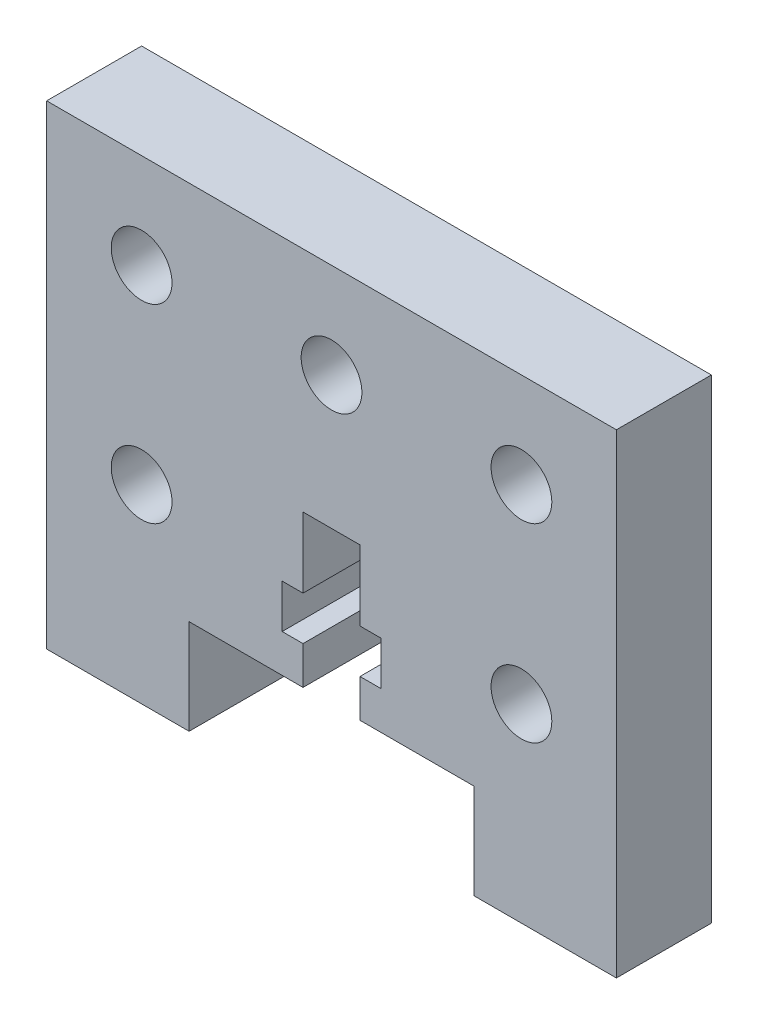
ISO-10303-21;
HEADER;
FILE_DESCRIPTION(('STEP AP214'),'2;1');
FILE_NAME('part.step','',(''),(''),'','','');
FILE_SCHEMA(('AUTOMOTIVE_DESIGN { 1 0 10303 214 1 1 1 1 }'));
ENDSEC;
DATA;
#1=APPLICATION_CONTEXT('core data for automotive mechanical design processes');
#2=APPLICATION_PROTOCOL_DEFINITION('international standard','automotive_design',2000,#1);
#3=PRODUCT_CONTEXT('',#1,'mechanical');
#4=PRODUCT('Part','Part','',(#3));
#5=PRODUCT_RELATED_PRODUCT_CATEGORY('part','',(#4));
#6=PRODUCT_DEFINITION_FORMATION('','',#4);
#7=PRODUCT_DEFINITION_CONTEXT('part definition',#1,'design');
#8=PRODUCT_DEFINITION('design','',#6,#7);
#9=PRODUCT_DEFINITION_SHAPE('','',#8);
#10=(LENGTH_UNIT() NAMED_UNIT(*) SI_UNIT(.MILLI.,.METRE.));
#11=(NAMED_UNIT(*) PLANE_ANGLE_UNIT() SI_UNIT($,.RADIAN.));
#12=(NAMED_UNIT(*) SI_UNIT($,.STERADIAN.) SOLID_ANGLE_UNIT());
#13=UNCERTAINTY_MEASURE_WITH_UNIT(LENGTH_MEASURE(1.E-05),#10,'distance_accuracy_value','');
#14=(GEOMETRIC_REPRESENTATION_CONTEXT(3) GLOBAL_UNCERTAINTY_ASSIGNED_CONTEXT((#13)) GLOBAL_UNIT_ASSIGNED_CONTEXT((#10,
#11,#12)) REPRESENTATION_CONTEXT('',''));
#15=CARTESIAN_POINT('',(0.,0.,0.));
#16=DIRECTION('',(0.,0.,1.));
#17=DIRECTION('',(1.,0.,0.));
#18=AXIS2_PLACEMENT_3D('',#15,#16,#17);
#19=CARTESIAN_POINT('',(0.,0.,5.));
#20=DIRECTION('',(0.,0.,1.));
#21=DIRECTION('',(1.,0.,0.));
#22=AXIS2_PLACEMENT_3D('',#19,#20,#21);
#23=PLANE('',#22);
#24=CARTESIAN_POINT('',(15.,20.,5.));
#25=DIRECTION('',(0.,0.,1.));
#26=DIRECTION('',(1.,0.,0.));
#27=AXIS2_PLACEMENT_3D('',#24,#25,#26);
#28=CIRCLE('',#27,1.6);
#29=CARTESIAN_POINT('',(16.6,20.,5.));
#30=VERTEX_POINT('',#29);
#31=EDGE_CURVE('E399',#30,#30,#28,.T.);
#32=ORIENTED_EDGE('',*,*,#31,.F.);
#33=EDGE_LOOP('',(#32));
#34=FACE_BOUND('',#33,.T.);
#35=CARTESIAN_POINT('',(4.99999999999997,20.,5.));
#36=DIRECTION('',(0.,0.,1.));
#37=DIRECTION('',(1.,0.,0.));
#38=AXIS2_PLACEMENT_3D('',#35,#36,#37);
#39=CIRCLE('',#38,1.6);
#40=CARTESIAN_POINT('',(6.59999999999997,20.,5.));
#41=VERTEX_POINT('',#40);
#42=EDGE_CURVE('E411',#41,#41,#39,.T.);
#43=ORIENTED_EDGE('',*,*,#42,.F.);
#44=EDGE_LOOP('',(#43));
#45=FACE_BOUND('',#44,.T.);
#46=DIRECTION('',(0.,-1.,0.));
#47=VECTOR('',#46,1.);
#48=CARTESIAN_POINT('',(0.,25.,5.));
#49=LINE('',#48,#47);
#50=CARTESIAN_POINT('',(0.,25.,5.));
#51=VERTEX_POINT('',#50);
#52=CARTESIAN_POINT('',(0.,0.,5.));
#53=VERTEX_POINT('',#52);
#54=EDGE_CURVE('E241',#51,#53,#49,.T.);
#55=ORIENTED_EDGE('',*,*,#54,.T.);
#56=DIRECTION('',(1.,0.,0.));
#57=VECTOR('',#56,1.);
#58=CARTESIAN_POINT('',(0.,0.,5.));
#59=LINE('',#58,#57);
#60=CARTESIAN_POINT('',(7.5,0.,5.));
#61=VERTEX_POINT('',#60);
#62=EDGE_CURVE('E129',#53,#61,#59,.T.);
#63=ORIENTED_EDGE('',*,*,#62,.T.);
#64=DIRECTION('',(0.,1.,0.));
#65=VECTOR('',#64,1.);
#66=CARTESIAN_POINT('',(7.5,0.,5.));
#67=LINE('',#66,#65);
#68=CARTESIAN_POINT('',(7.50000000000001,5.,5.));
#69=VERTEX_POINT('',#68);
#70=EDGE_CURVE('E292',#61,#69,#67,.T.);
#71=ORIENTED_EDGE('',*,*,#70,.T.);
#72=DIRECTION('',(1.,0.,0.));
#73=VECTOR('',#72,1.);
#74=CARTESIAN_POINT('',(7.50000000000001,5.,5.));
#75=LINE('',#74,#73);
#76=CARTESIAN_POINT('',(13.5,5.,5.));
#77=VERTEX_POINT('',#76);
#78=EDGE_CURVE('E311',#69,#77,#75,.T.);
#79=ORIENTED_EDGE('',*,*,#78,.T.);
#80=DIRECTION('',(0.,1.,0.));
#81=VECTOR('',#80,1.);
#82=CARTESIAN_POINT('',(13.5,5.,5.));
#83=LINE('',#82,#81);
#84=CARTESIAN_POINT('',(13.5,7.,5.));
#85=VERTEX_POINT('',#84);
#86=EDGE_CURVE('E308',#77,#85,#83,.T.);
#87=ORIENTED_EDGE('',*,*,#86,.T.);
#88=DIRECTION('',(-1.,0.,0.));
#89=VECTOR('',#88,1.);
#90=CARTESIAN_POINT('',(13.5,7.,5.));
#91=LINE('',#90,#89);
#92=CARTESIAN_POINT('',(12.4,7.,5.));
#93=VERTEX_POINT('',#92);
#94=EDGE_CURVE('E310',#85,#93,#91,.T.);
#95=ORIENTED_EDGE('',*,*,#94,.T.);
#96=DIRECTION('',(0.,1.,0.));
#97=VECTOR('',#96,1.);
#98=CARTESIAN_POINT('',(12.4,7.,5.));
#99=LINE('',#98,#97);
#100=CARTESIAN_POINT('',(12.4,9.3,5.));
#101=VERTEX_POINT('',#100);
#102=EDGE_CURVE('E313',#93,#101,#99,.T.);
#103=ORIENTED_EDGE('',*,*,#102,.T.);
#104=DIRECTION('',(1.,0.,0.));
#105=VECTOR('',#104,1.);
#106=CARTESIAN_POINT('',(12.4,9.3,5.));
#107=LINE('',#106,#105);
#108=CARTESIAN_POINT('',(13.5,9.3,5.));
#109=VERTEX_POINT('',#108);
#110=EDGE_CURVE('E319',#101,#109,#107,.T.);
#111=ORIENTED_EDGE('',*,*,#110,.T.);
#112=DIRECTION('',(0.,1.,0.));
#113=VECTOR('',#112,1.);
#114=CARTESIAN_POINT('',(13.5,9.3,5.));
#115=LINE('',#114,#113);
#116=CARTESIAN_POINT('',(13.5,13.,5.));
#117=VERTEX_POINT('',#116);
#118=EDGE_CURVE('E321',#109,#117,#115,.T.);
#119=ORIENTED_EDGE('',*,*,#118,.T.);
#120=DIRECTION('',(1.,0.,0.));
#121=VECTOR('',#120,1.);
#122=CARTESIAN_POINT('',(13.5,13.,5.));
#123=LINE('',#122,#121);
#124=CARTESIAN_POINT('',(16.5,13.,5.));
#125=VERTEX_POINT('',#124);
#126=EDGE_CURVE('E323',#117,#125,#123,.T.);
#127=ORIENTED_EDGE('',*,*,#126,.T.);
#128=DIRECTION('',(0.,-1.,0.));
#129=VECTOR('',#128,1.);
#130=CARTESIAN_POINT('',(16.5,13.,5.));
#131=LINE('',#130,#129);
#132=CARTESIAN_POINT('',(16.5,9.3,5.));
#133=VERTEX_POINT('',#132);
#134=EDGE_CURVE('E325',#125,#133,#131,.T.);
#135=ORIENTED_EDGE('',*,*,#134,.T.);
#136=DIRECTION('',(1.,0.,0.));
#137=VECTOR('',#136,1.);
#138=CARTESIAN_POINT('',(16.5,9.3,5.));
#139=LINE('',#138,#137);
#140=CARTESIAN_POINT('',(17.6,9.3,5.));
#141=VERTEX_POINT('',#140);
#142=EDGE_CURVE('E327',#133,#141,#139,.T.);
#143=ORIENTED_EDGE('',*,*,#142,.T.);
#144=DIRECTION('',(0.,-1.,0.));
#145=VECTOR('',#144,1.);
#146=CARTESIAN_POINT('',(17.6,9.3,5.));
#147=LINE('',#146,#145);
#148=CARTESIAN_POINT('',(17.6,7.,5.));
#149=VERTEX_POINT('',#148);
#150=EDGE_CURVE('E329',#141,#149,#147,.T.);
#151=ORIENTED_EDGE('',*,*,#150,.T.);
#152=DIRECTION('',(-1.,0.,0.));
#153=VECTOR('',#152,1.);
#154=CARTESIAN_POINT('',(17.6,7.,5.));
#155=LINE('',#154,#153);
#156=CARTESIAN_POINT('',(16.5,7.,5.));
#157=VERTEX_POINT('',#156);
#158=EDGE_CURVE('E331',#149,#157,#155,.T.);
#159=ORIENTED_EDGE('',*,*,#158,.T.);
#160=DIRECTION('',(0.,-1.,0.));
#161=VECTOR('',#160,1.);
#162=CARTESIAN_POINT('',(16.5,7.,5.));
#163=LINE('',#162,#161);
#164=CARTESIAN_POINT('',(16.5,5.,5.));
#165=VERTEX_POINT('',#164);
#166=EDGE_CURVE('E333',#157,#165,#163,.T.);
#167=ORIENTED_EDGE('',*,*,#166,.T.);
#168=DIRECTION('',(1.,0.,0.));
#169=VECTOR('',#168,1.);
#170=CARTESIAN_POINT('',(16.5,5.,5.));
#171=LINE('',#170,#169);
#172=CARTESIAN_POINT('',(22.5,5.,5.));
#173=VERTEX_POINT('',#172);
#174=EDGE_CURVE('E335',#165,#173,#171,.T.);
#175=ORIENTED_EDGE('',*,*,#174,.T.);
#176=DIRECTION('',(0.,-1.,0.));
#177=VECTOR('',#176,1.);
#178=CARTESIAN_POINT('',(22.5,5.,5.));
#179=LINE('',#178,#177);
#180=CARTESIAN_POINT('',(22.5,0.,5.));
#181=VERTEX_POINT('',#180);
#182=EDGE_CURVE('E184',#173,#181,#179,.T.);
#183=ORIENTED_EDGE('',*,*,#182,.T.);
#184=DIRECTION('',(1.,0.,0.));
#185=VECTOR('',#184,1.);
#186=CARTESIAN_POINT('',(22.5,0.,5.));
#187=LINE('',#186,#185);
#188=CARTESIAN_POINT('',(30.,0.,5.));
#189=VERTEX_POINT('',#188);
#190=EDGE_CURVE('E178',#181,#189,#187,.T.);
#191=ORIENTED_EDGE('',*,*,#190,.T.);
#192=DIRECTION('',(0.,1.,0.));
#193=VECTOR('',#192,1.);
#194=CARTESIAN_POINT('',(30.,0.,5.));
#195=LINE('',#194,#193);
#196=CARTESIAN_POINT('',(30.,25.,5.));
#197=VERTEX_POINT('',#196);
#198=EDGE_CURVE('E182',#189,#197,#195,.T.);
#199=ORIENTED_EDGE('',*,*,#198,.T.);
#200=DIRECTION('',(-1.,0.,0.));
#201=VECTOR('',#200,1.);
#202=CARTESIAN_POINT('',(30.,25.,5.));
#203=LINE('',#202,#201);
#204=EDGE_CURVE('E50',#197,#51,#203,.T.);
#205=ORIENTED_EDGE('',*,*,#204,.T.);
#206=EDGE_LOOP('',(#55,#63,#71,#79,#87,#95,#103,#111,#119,#127,#135,#143,#151,#159,#167,#175,
#183,#191,#199,#205));
#207=FACE_BOUND('',#206,.T.);
#208=CARTESIAN_POINT('',(5.,10.,5.));
#209=DIRECTION('',(0.,0.,1.));
#210=DIRECTION('',(1.,0.,0.));
#211=AXIS2_PLACEMENT_3D('',#208,#209,#210);
#212=CIRCLE('',#211,1.6);
#213=CARTESIAN_POINT('',(6.6,10.,5.));
#214=VERTEX_POINT('',#213);
#215=EDGE_CURVE('E206',#214,#214,#212,.T.);
#216=ORIENTED_EDGE('',*,*,#215,.F.);
#217=EDGE_LOOP('',(#216));
#218=FACE_BOUND('',#217,.T.);
#219=CARTESIAN_POINT('',(25.,10.,5.));
#220=DIRECTION('',(0.,0.,1.));
#221=DIRECTION('',(1.,0.,0.));
#222=AXIS2_PLACEMENT_3D('',#219,#220,#221);
#223=CIRCLE('',#222,1.6);
#224=CARTESIAN_POINT('',(26.6,10.,5.));
#225=VERTEX_POINT('',#224);
#226=EDGE_CURVE('E405',#225,#225,#223,.T.);
#227=ORIENTED_EDGE('',*,*,#226,.F.);
#228=EDGE_LOOP('',(#227));
#229=FACE_BOUND('',#228,.T.);
#230=CARTESIAN_POINT('',(25.,20.,5.));
#231=DIRECTION('',(0.,0.,1.));
#232=DIRECTION('',(1.,0.,0.));
#233=AXIS2_PLACEMENT_3D('',#230,#231,#232);
#234=CIRCLE('',#233,1.6);
#235=CARTESIAN_POINT('',(26.6,20.,5.));
#236=VERTEX_POINT('',#235);
#237=EDGE_CURVE('E390',#236,#236,#234,.T.);
#238=ORIENTED_EDGE('',*,*,#237,.F.);
#239=EDGE_LOOP('',(#238));
#240=FACE_BOUND('',#239,.T.);
#241=ADVANCED_FACE('F33',(#34,#45,#207,#218,#229,#240),#23,.T.);
#242=CARTESIAN_POINT('',(0.,0.,0.));
#243=DIRECTION('',(0.,0.,1.));
#244=DIRECTION('',(1.,0.,0.));
#245=AXIS2_PLACEMENT_3D('',#242,#243,#244);
#246=PLANE('',#245);
#247=DIRECTION('',(0.,-1.,0.));
#248=VECTOR('',#247,1.);
#249=CARTESIAN_POINT('',(0.,25.,0.));
#250=LINE('',#249,#248);
#251=CARTESIAN_POINT('',(0.,25.,0.));
#252=VERTEX_POINT('',#251);
#253=CARTESIAN_POINT('',(0.,0.,0.));
#254=VERTEX_POINT('',#253);
#255=EDGE_CURVE('E202',#252,#254,#250,.T.);
#256=ORIENTED_EDGE('',*,*,#255,.F.);
#257=DIRECTION('',(-1.,0.,0.));
#258=VECTOR('',#257,1.);
#259=CARTESIAN_POINT('',(30.,25.,0.));
#260=LINE('',#259,#258);
#261=CARTESIAN_POINT('',(30.,25.,0.));
#262=VERTEX_POINT('',#261);
#263=EDGE_CURVE('E121',#262,#252,#260,.T.);
#264=ORIENTED_EDGE('',*,*,#263,.F.);
#265=DIRECTION('',(0.,1.,0.));
#266=VECTOR('',#265,1.);
#267=CARTESIAN_POINT('',(30.,0.,0.));
#268=LINE('',#267,#266);
#269=CARTESIAN_POINT('',(30.,0.,0.));
#270=VERTEX_POINT('',#269);
#271=EDGE_CURVE('E115',#270,#262,#268,.T.);
#272=ORIENTED_EDGE('',*,*,#271,.F.);
#273=DIRECTION('',(1.,0.,0.));
#274=VECTOR('',#273,1.);
#275=CARTESIAN_POINT('',(22.5,0.,0.));
#276=LINE('',#275,#274);
#277=CARTESIAN_POINT('',(22.5,0.,0.));
#278=VERTEX_POINT('',#277);
#279=EDGE_CURVE('E192',#278,#270,#276,.T.);
#280=ORIENTED_EDGE('',*,*,#279,.F.);
#281=DIRECTION('',(0.,-1.,0.));
#282=VECTOR('',#281,1.);
#283=CARTESIAN_POINT('',(22.5,5.,0.));
#284=LINE('',#283,#282);
#285=CARTESIAN_POINT('',(22.5,5.,0.));
#286=VERTEX_POINT('',#285);
#287=EDGE_CURVE('E236',#286,#278,#284,.T.);
#288=ORIENTED_EDGE('',*,*,#287,.F.);
#289=DIRECTION('',(1.,0.,0.));
#290=VECTOR('',#289,1.);
#291=CARTESIAN_POINT('',(16.5,5.,0.));
#292=LINE('',#291,#290);
#293=CARTESIAN_POINT('',(16.5,5.,0.));
#294=VERTEX_POINT('',#293);
#295=EDGE_CURVE('E234',#294,#286,#292,.T.);
#296=ORIENTED_EDGE('',*,*,#295,.F.);
#297=DIRECTION('',(0.,-1.,0.));
#298=VECTOR('',#297,1.);
#299=CARTESIAN_POINT('',(16.5,7.,0.));
#300=LINE('',#299,#298);
#301=CARTESIAN_POINT('',(16.5,7.,0.));
#302=VERTEX_POINT('',#301);
#303=EDGE_CURVE('E232',#302,#294,#300,.T.);
#304=ORIENTED_EDGE('',*,*,#303,.F.);
#305=DIRECTION('',(-1.,0.,0.));
#306=VECTOR('',#305,1.);
#307=CARTESIAN_POINT('',(17.6,7.,0.));
#308=LINE('',#307,#306);
#309=CARTESIAN_POINT('',(17.6,7.,0.));
#310=VERTEX_POINT('',#309);
#311=EDGE_CURVE('E230',#310,#302,#308,.T.);
#312=ORIENTED_EDGE('',*,*,#311,.F.);
#313=DIRECTION('',(0.,-1.,0.));
#314=VECTOR('',#313,1.);
#315=CARTESIAN_POINT('',(17.6,9.3,0.));
#316=LINE('',#315,#314);
#317=CARTESIAN_POINT('',(17.6,9.3,0.));
#318=VERTEX_POINT('',#317);
#319=EDGE_CURVE('E228',#318,#310,#316,.T.);
#320=ORIENTED_EDGE('',*,*,#319,.F.);
#321=DIRECTION('',(1.,0.,0.));
#322=VECTOR('',#321,1.);
#323=CARTESIAN_POINT('',(16.5,9.3,0.));
#324=LINE('',#323,#322);
#325=CARTESIAN_POINT('',(16.5,9.3,0.));
#326=VERTEX_POINT('',#325);
#327=EDGE_CURVE('E226',#326,#318,#324,.T.);
#328=ORIENTED_EDGE('',*,*,#327,.F.);
#329=DIRECTION('',(0.,-1.,0.));
#330=VECTOR('',#329,1.);
#331=CARTESIAN_POINT('',(16.5,13.,0.));
#332=LINE('',#331,#330);
#333=CARTESIAN_POINT('',(16.5,13.,0.));
#334=VERTEX_POINT('',#333);
#335=EDGE_CURVE('E224',#334,#326,#332,.T.);
#336=ORIENTED_EDGE('',*,*,#335,.F.);
#337=DIRECTION('',(1.,0.,0.));
#338=VECTOR('',#337,1.);
#339=CARTESIAN_POINT('',(13.5,13.,0.));
#340=LINE('',#339,#338);
#341=CARTESIAN_POINT('',(13.5,13.,0.));
#342=VERTEX_POINT('',#341);
#343=EDGE_CURVE('E222',#342,#334,#340,.T.);
#344=ORIENTED_EDGE('',*,*,#343,.F.);
#345=DIRECTION('',(0.,1.,0.));
#346=VECTOR('',#345,1.);
#347=CARTESIAN_POINT('',(13.5,9.3,0.));
#348=LINE('',#347,#346);
#349=CARTESIAN_POINT('',(13.5,9.3,0.));
#350=VERTEX_POINT('',#349);
#351=EDGE_CURVE('E220',#350,#342,#348,.T.);
#352=ORIENTED_EDGE('',*,*,#351,.F.);
#353=DIRECTION('',(1.,0.,0.));
#354=VECTOR('',#353,1.);
#355=CARTESIAN_POINT('',(12.4,9.3,0.));
#356=LINE('',#355,#354);
#357=CARTESIAN_POINT('',(12.4,9.3,0.));
#358=VERTEX_POINT('',#357);
#359=EDGE_CURVE('E218',#358,#350,#356,.T.);
#360=ORIENTED_EDGE('',*,*,#359,.F.);
#361=DIRECTION('',(0.,1.,0.));
#362=VECTOR('',#361,1.);
#363=CARTESIAN_POINT('',(12.4,7.,0.));
#364=LINE('',#363,#362);
#365=CARTESIAN_POINT('',(12.4,7.,0.));
#366=VERTEX_POINT('',#365);
#367=EDGE_CURVE('E216',#366,#358,#364,.T.);
#368=ORIENTED_EDGE('',*,*,#367,.F.);
#369=DIRECTION('',(-1.,0.,0.));
#370=VECTOR('',#369,1.);
#371=CARTESIAN_POINT('',(13.5,7.,0.));
#372=LINE('',#371,#370);
#373=CARTESIAN_POINT('',(13.5,7.,0.));
#374=VERTEX_POINT('',#373);
#375=EDGE_CURVE('E214',#374,#366,#372,.T.);
#376=ORIENTED_EDGE('',*,*,#375,.F.);
#377=DIRECTION('',(0.,1.,0.));
#378=VECTOR('',#377,1.);
#379=CARTESIAN_POINT('',(13.5,5.,0.));
#380=LINE('',#379,#378);
#381=CARTESIAN_POINT('',(13.5,5.,0.));
#382=VERTEX_POINT('',#381);
#383=EDGE_CURVE('E212',#382,#374,#380,.T.);
#384=ORIENTED_EDGE('',*,*,#383,.F.);
#385=DIRECTION('',(1.,0.,0.));
#386=VECTOR('',#385,1.);
#387=CARTESIAN_POINT('',(7.50000000000001,5.,0.));
#388=LINE('',#387,#386);
#389=CARTESIAN_POINT('',(7.50000000000001,5.,0.));
#390=VERTEX_POINT('',#389);
#391=EDGE_CURVE('E210',#390,#382,#388,.T.);
#392=ORIENTED_EDGE('',*,*,#391,.F.);
#393=DIRECTION('',(0.,1.,0.));
#394=VECTOR('',#393,1.);
#395=CARTESIAN_POINT('',(7.5,0.,0.));
#396=LINE('',#395,#394);
#397=CARTESIAN_POINT('',(7.5,0.,0.));
#398=VERTEX_POINT('',#397);
#399=EDGE_CURVE('E208',#398,#390,#396,.T.);
#400=ORIENTED_EDGE('',*,*,#399,.F.);
#401=DIRECTION('',(1.,0.,0.));
#402=VECTOR('',#401,1.);
#403=CARTESIAN_POINT('',(0.,0.,0.));
#404=LINE('',#403,#402);
#405=EDGE_CURVE('E205',#254,#398,#404,.T.);
#406=ORIENTED_EDGE('',*,*,#405,.F.);
#407=EDGE_LOOP('',(#256,#264,#272,#280,#288,#296,#304,#312,#320,#328,#336,#344,#352,#360,#368,
#376,#384,#392,#400,#406));
#408=FACE_BOUND('',#407,.T.);
#409=CARTESIAN_POINT('',(5.,10.,0.));
#410=DIRECTION('',(0.,0.,1.));
#411=DIRECTION('',(1.,0.,0.));
#412=AXIS2_PLACEMENT_3D('',#409,#410,#411);
#413=CIRCLE('',#412,1.6);
#414=CARTESIAN_POINT('',(6.6,10.,0.));
#415=VERTEX_POINT('',#414);
#416=EDGE_CURVE('E414',#415,#415,#413,.T.);
#417=ORIENTED_EDGE('',*,*,#416,.T.);
#418=EDGE_LOOP('',(#417));
#419=FACE_BOUND('',#418,.T.);
#420=CARTESIAN_POINT('',(4.99999999999997,20.,0.));
#421=DIRECTION('',(0.,0.,1.));
#422=DIRECTION('',(1.,0.,0.));
#423=AXIS2_PLACEMENT_3D('',#420,#421,#422);
#424=CIRCLE('',#423,1.6);
#425=CARTESIAN_POINT('',(6.59999999999997,20.,0.));
#426=VERTEX_POINT('',#425);
#427=EDGE_CURVE('E408',#426,#426,#424,.T.);
#428=ORIENTED_EDGE('',*,*,#427,.T.);
#429=EDGE_LOOP('',(#428));
#430=FACE_BOUND('',#429,.T.);
#431=CARTESIAN_POINT('',(25.,10.,0.));
#432=DIRECTION('',(0.,0.,1.));
#433=DIRECTION('',(1.,0.,0.));
#434=AXIS2_PLACEMENT_3D('',#431,#432,#433);
#435=CIRCLE('',#434,1.6);
#436=CARTESIAN_POINT('',(26.6,10.,0.));
#437=VERTEX_POINT('',#436);
#438=EDGE_CURVE('E402',#437,#437,#435,.T.);
#439=ORIENTED_EDGE('',*,*,#438,.T.);
#440=EDGE_LOOP('',(#439));
#441=FACE_BOUND('',#440,.T.);
#442=CARTESIAN_POINT('',(15.,20.,0.));
#443=DIRECTION('',(0.,0.,1.));
#444=DIRECTION('',(1.,0.,0.));
#445=AXIS2_PLACEMENT_3D('',#442,#443,#444);
#446=CIRCLE('',#445,1.6);
#447=CARTESIAN_POINT('',(16.6,20.,0.));
#448=VERTEX_POINT('',#447);
#449=EDGE_CURVE('E396',#448,#448,#446,.T.);
#450=ORIENTED_EDGE('',*,*,#449,.T.);
#451=EDGE_LOOP('',(#450));
#452=FACE_BOUND('',#451,.T.);
#453=CARTESIAN_POINT('',(25.,20.,0.));
#454=DIRECTION('',(0.,0.,1.));
#455=DIRECTION('',(1.,0.,0.));
#456=AXIS2_PLACEMENT_3D('',#453,#454,#455);
#457=CIRCLE('',#456,1.6);
#458=CARTESIAN_POINT('',(26.6,20.,0.));
#459=VERTEX_POINT('',#458);
#460=EDGE_CURVE('E393',#459,#459,#457,.T.);
#461=ORIENTED_EDGE('',*,*,#460,.T.);
#462=EDGE_LOOP('',(#461));
#463=FACE_BOUND('',#462,.T.);
#464=ADVANCED_FACE('F296',(#408,#419,#430,#441,#452,#463),#246,.F.);
#465=CARTESIAN_POINT('',(0.,25.,5.));
#466=DIRECTION('',(1.,0.,0.));
#467=DIRECTION('',(0.,1.,0.));
#468=AXIS2_PLACEMENT_3D('',#465,#466,#467);
#469=PLANE('',#468);
#470=ORIENTED_EDGE('',*,*,#255,.T.);
#471=DIRECTION('',(0.,0.,-1.));
#472=VECTOR('',#471,1.);
#473=CARTESIAN_POINT('',(0.,0.,5.));
#474=LINE('',#473,#472);
#475=EDGE_CURVE('E11',#53,#254,#474,.T.);
#476=ORIENTED_EDGE('',*,*,#475,.F.);
#477=ORIENTED_EDGE('',*,*,#54,.F.);
#478=DIRECTION('',(0.,0.,-1.));
#479=VECTOR('',#478,1.);
#480=CARTESIAN_POINT('',(0.,25.,5.));
#481=LINE('',#480,#479);
#482=EDGE_CURVE('E198',#51,#252,#481,.T.);
#483=ORIENTED_EDGE('',*,*,#482,.T.);
#484=EDGE_LOOP('',(#470,#476,#477,#483));
#485=FACE_BOUND('',#484,.T.);
#486=ADVANCED_FACE('F35',(#485),#469,.F.);
#487=CARTESIAN_POINT('',(0.,0.,5.));
#488=DIRECTION('',(0.,1.,0.));
#489=DIRECTION('',(0.,0.,1.));
#490=AXIS2_PLACEMENT_3D('',#487,#488,#489);
#491=PLANE('',#490);
#492=ORIENTED_EDGE('',*,*,#405,.T.);
#493=DIRECTION('',(0.,0.,-1.));
#494=VECTOR('',#493,1.);
#495=CARTESIAN_POINT('',(7.5,0.,5.));
#496=LINE('',#495,#494);
#497=EDGE_CURVE('E42',#61,#398,#496,.T.);
#498=ORIENTED_EDGE('',*,*,#497,.F.);
#499=ORIENTED_EDGE('',*,*,#62,.F.);
#500=ORIENTED_EDGE('',*,*,#475,.T.);
#501=EDGE_LOOP('',(#492,#498,#499,#500));
#502=FACE_BOUND('',#501,.T.);
#503=ADVANCED_FACE('F613',(#502),#491,.F.);
#504=CARTESIAN_POINT('',(7.5,0.,5.));
#505=DIRECTION('',(-1.,0.,0.));
#506=DIRECTION('',(0.,-1.,0.));
#507=AXIS2_PLACEMENT_3D('',#504,#505,#506);
#508=PLANE('',#507);
#509=ORIENTED_EDGE('',*,*,#399,.T.);
#510=DIRECTION('',(0.,0.,-1.));
#511=VECTOR('',#510,1.);
#512=CARTESIAN_POINT('',(7.50000000000001,5.,5.));
#513=LINE('',#512,#511);
#514=EDGE_CURVE('E284',#69,#390,#513,.T.);
#515=ORIENTED_EDGE('',*,*,#514,.F.);
#516=ORIENTED_EDGE('',*,*,#70,.F.);
#517=ORIENTED_EDGE('',*,*,#497,.T.);
#518=EDGE_LOOP('',(#509,#515,#516,#517));
#519=FACE_BOUND('',#518,.T.);
#520=ADVANCED_FACE('F290',(#519),#508,.F.);
#521=CARTESIAN_POINT('',(7.50000000000001,5.,5.));
#522=DIRECTION('',(0.,1.,0.));
#523=DIRECTION('',(0.,0.,1.));
#524=AXIS2_PLACEMENT_3D('',#521,#522,#523);
#525=PLANE('',#524);
#526=ORIENTED_EDGE('',*,*,#391,.T.);
#527=DIRECTION('',(0.,0.,-1.));
#528=VECTOR('',#527,1.);
#529=CARTESIAN_POINT('',(13.5,5.,5.));
#530=LINE('',#529,#528);
#531=EDGE_CURVE('E281',#77,#382,#530,.T.);
#532=ORIENTED_EDGE('',*,*,#531,.F.);
#533=ORIENTED_EDGE('',*,*,#78,.F.);
#534=ORIENTED_EDGE('',*,*,#514,.T.);
#535=EDGE_LOOP('',(#526,#532,#533,#534));
#536=FACE_BOUND('',#535,.T.);
#537=ADVANCED_FACE('F302',(#536),#525,.F.);
#538=CARTESIAN_POINT('',(13.5,5.,5.));
#539=DIRECTION('',(-1.,0.,0.));
#540=DIRECTION('',(0.,-1.,0.));
#541=AXIS2_PLACEMENT_3D('',#538,#539,#540);
#542=PLANE('',#541);
#543=ORIENTED_EDGE('',*,*,#383,.T.);
#544=DIRECTION('',(0.,0.,-1.));
#545=VECTOR('',#544,1.);
#546=CARTESIAN_POINT('',(13.5,7.,5.));
#547=LINE('',#546,#545);
#548=EDGE_CURVE('E278',#85,#374,#547,.T.);
#549=ORIENTED_EDGE('',*,*,#548,.F.);
#550=ORIENTED_EDGE('',*,*,#86,.F.);
#551=ORIENTED_EDGE('',*,*,#531,.T.);
#552=EDGE_LOOP('',(#543,#549,#550,#551));
#553=FACE_BOUND('',#552,.T.);
#554=ADVANCED_FACE('F306',(#553),#542,.F.);
#555=CARTESIAN_POINT('',(13.5,7.,5.));
#556=DIRECTION('',(0.,-1.,0.));
#557=DIRECTION('',(0.,0.,-1.));
#558=AXIS2_PLACEMENT_3D('',#555,#556,#557);
#559=PLANE('',#558);
#560=ORIENTED_EDGE('',*,*,#375,.T.);
#561=DIRECTION('',(0.,0.,-1.));
#562=VECTOR('',#561,1.);
#563=CARTESIAN_POINT('',(12.4,7.,5.));
#564=LINE('',#563,#562);
#565=EDGE_CURVE('E275',#93,#366,#564,.T.);
#566=ORIENTED_EDGE('',*,*,#565,.F.);
#567=ORIENTED_EDGE('',*,*,#94,.F.);
#568=ORIENTED_EDGE('',*,*,#548,.T.);
#569=EDGE_LOOP('',(#560,#566,#567,#568));
#570=FACE_BOUND('',#569,.T.);
#571=ADVANCED_FACE('F578',(#570),#559,.F.);
#572=CARTESIAN_POINT('',(12.4,7.,5.));
#573=DIRECTION('',(-1.,0.,0.));
#574=DIRECTION('',(0.,-1.,0.));
#575=AXIS2_PLACEMENT_3D('',#572,#573,#574);
#576=PLANE('',#575);
#577=ORIENTED_EDGE('',*,*,#367,.T.);
#578=DIRECTION('',(0.,0.,-1.));
#579=VECTOR('',#578,1.);
#580=CARTESIAN_POINT('',(12.4,9.3,5.));
#581=LINE('',#580,#579);
#582=EDGE_CURVE('E272',#101,#358,#581,.T.);
#583=ORIENTED_EDGE('',*,*,#582,.F.);
#584=ORIENTED_EDGE('',*,*,#102,.F.);
#585=ORIENTED_EDGE('',*,*,#565,.T.);
#586=EDGE_LOOP('',(#577,#583,#584,#585));
#587=FACE_BOUND('',#586,.T.);
#588=ADVANCED_FACE('F568',(#587),#576,.F.);
#589=CARTESIAN_POINT('',(12.4,9.3,5.));
#590=DIRECTION('',(0.,1.,0.));
#591=DIRECTION('',(0.,0.,1.));
#592=AXIS2_PLACEMENT_3D('',#589,#590,#591);
#593=PLANE('',#592);
#594=ORIENTED_EDGE('',*,*,#359,.T.);
#595=DIRECTION('',(0.,0.,-1.));
#596=VECTOR('',#595,1.);
#597=CARTESIAN_POINT('',(13.5,9.3,5.));
#598=LINE('',#597,#596);
#599=EDGE_CURVE('E269',#109,#350,#598,.T.);
#600=ORIENTED_EDGE('',*,*,#599,.F.);
#601=ORIENTED_EDGE('',*,*,#110,.F.);
#602=ORIENTED_EDGE('',*,*,#582,.T.);
#603=EDGE_LOOP('',(#594,#600,#601,#602));
#604=FACE_BOUND('',#603,.T.);
#605=ADVANCED_FACE('F558',(#604),#593,.F.);
#606=CARTESIAN_POINT('',(13.5,9.3,5.));
#607=DIRECTION('',(-1.,0.,0.));
#608=DIRECTION('',(0.,0.,1.));
#609=AXIS2_PLACEMENT_3D('',#606,#607,#608);
#610=PLANE('',#609);
#611=ORIENTED_EDGE('',*,*,#351,.T.);
#612=DIRECTION('',(0.,0.,-1.));
#613=VECTOR('',#612,1.);
#614=CARTESIAN_POINT('',(13.5,13.,5.));
#615=LINE('',#614,#613);
#616=EDGE_CURVE('E266',#117,#342,#615,.T.);
#617=ORIENTED_EDGE('',*,*,#616,.F.);
#618=ORIENTED_EDGE('',*,*,#118,.F.);
#619=ORIENTED_EDGE('',*,*,#599,.T.);
#620=EDGE_LOOP('',(#611,#617,#618,#619));
#621=FACE_BOUND('',#620,.T.);
#622=ADVANCED_FACE('F548',(#621),#610,.F.);
#623=CARTESIAN_POINT('',(13.5,13.,5.));
#624=DIRECTION('',(0.,1.,0.));
#625=DIRECTION('',(0.,0.,1.));
#626=AXIS2_PLACEMENT_3D('',#623,#624,#625);
#627=PLANE('',#626);
#628=ORIENTED_EDGE('',*,*,#343,.T.);
#629=DIRECTION('',(0.,0.,-1.));
#630=VECTOR('',#629,1.);
#631=CARTESIAN_POINT('',(16.5,13.,5.));
#632=LINE('',#631,#630);
#633=EDGE_CURVE('E263',#125,#334,#632,.T.);
#634=ORIENTED_EDGE('',*,*,#633,.F.);
#635=ORIENTED_EDGE('',*,*,#126,.F.);
#636=ORIENTED_EDGE('',*,*,#616,.T.);
#637=EDGE_LOOP('',(#628,#634,#635,#636));
#638=FACE_BOUND('',#637,.T.);
#639=ADVANCED_FACE('F538',(#638),#627,.F.);
#640=CARTESIAN_POINT('',(16.5,13.,5.));
#641=DIRECTION('',(1.,0.,0.));
#642=DIRECTION('',(0.,0.,-1.));
#643=AXIS2_PLACEMENT_3D('',#640,#641,#642);
#644=PLANE('',#643);
#645=ORIENTED_EDGE('',*,*,#335,.T.);
#646=DIRECTION('',(0.,0.,-1.));
#647=VECTOR('',#646,1.);
#648=CARTESIAN_POINT('',(16.5,9.3,5.));
#649=LINE('',#648,#647);
#650=EDGE_CURVE('E260',#133,#326,#649,.T.);
#651=ORIENTED_EDGE('',*,*,#650,.F.);
#652=ORIENTED_EDGE('',*,*,#134,.F.);
#653=ORIENTED_EDGE('',*,*,#633,.T.);
#654=EDGE_LOOP('',(#645,#651,#652,#653));
#655=FACE_BOUND('',#654,.T.);
#656=ADVANCED_FACE('F528',(#655),#644,.F.);
#657=CARTESIAN_POINT('',(16.5,9.3,5.));
#658=DIRECTION('',(0.,1.,0.));
#659=DIRECTION('',(0.,0.,1.));
#660=AXIS2_PLACEMENT_3D('',#657,#658,#659);
#661=PLANE('',#660);
#662=ORIENTED_EDGE('',*,*,#327,.T.);
#663=DIRECTION('',(0.,0.,-1.));
#664=VECTOR('',#663,1.);
#665=CARTESIAN_POINT('',(17.6,9.3,5.));
#666=LINE('',#665,#664);
#667=EDGE_CURVE('E257',#141,#318,#666,.T.);
#668=ORIENTED_EDGE('',*,*,#667,.F.);
#669=ORIENTED_EDGE('',*,*,#142,.F.);
#670=ORIENTED_EDGE('',*,*,#650,.T.);
#671=EDGE_LOOP('',(#662,#668,#669,#670));
#672=FACE_BOUND('',#671,.T.);
#673=ADVANCED_FACE('F518',(#672),#661,.F.);
#674=CARTESIAN_POINT('',(17.6,9.3,5.));
#675=DIRECTION('',(1.,0.,0.));
#676=DIRECTION('',(0.,0.,-1.));
#677=AXIS2_PLACEMENT_3D('',#674,#675,#676);
#678=PLANE('',#677);
#679=ORIENTED_EDGE('',*,*,#319,.T.);
#680=DIRECTION('',(0.,0.,-1.));
#681=VECTOR('',#680,1.);
#682=CARTESIAN_POINT('',(17.6,7.,5.));
#683=LINE('',#682,#681);
#684=EDGE_CURVE('E254',#149,#310,#683,.T.);
#685=ORIENTED_EDGE('',*,*,#684,.F.);
#686=ORIENTED_EDGE('',*,*,#150,.F.);
#687=ORIENTED_EDGE('',*,*,#667,.T.);
#688=EDGE_LOOP('',(#679,#685,#686,#687));
#689=FACE_BOUND('',#688,.T.);
#690=ADVANCED_FACE('F508',(#689),#678,.F.);
#691=CARTESIAN_POINT('',(17.6,7.,5.));
#692=DIRECTION('',(0.,-1.,0.));
#693=DIRECTION('',(1.,0.,0.));
#694=AXIS2_PLACEMENT_3D('',#691,#692,#693);
#695=PLANE('',#694);
#696=ORIENTED_EDGE('',*,*,#311,.T.);
#697=DIRECTION('',(0.,0.,-1.));
#698=VECTOR('',#697,1.);
#699=CARTESIAN_POINT('',(16.5,7.,5.));
#700=LINE('',#699,#698);
#701=EDGE_CURVE('E251',#157,#302,#700,.T.);
#702=ORIENTED_EDGE('',*,*,#701,.F.);
#703=ORIENTED_EDGE('',*,*,#158,.F.);
#704=ORIENTED_EDGE('',*,*,#684,.T.);
#705=EDGE_LOOP('',(#696,#702,#703,#704));
#706=FACE_BOUND('',#705,.T.);
#707=ADVANCED_FACE('F498',(#706),#695,.F.);
#708=CARTESIAN_POINT('',(16.5,7.,5.));
#709=DIRECTION('',(1.,0.,0.));
#710=DIRECTION('',(0.,1.,0.));
#711=AXIS2_PLACEMENT_3D('',#708,#709,#710);
#712=PLANE('',#711);
#713=ORIENTED_EDGE('',*,*,#303,.T.);
#714=DIRECTION('',(0.,0.,-1.));
#715=VECTOR('',#714,1.);
#716=CARTESIAN_POINT('',(16.5,5.,5.));
#717=LINE('',#716,#715);
#718=EDGE_CURVE('E248',#165,#294,#717,.T.);
#719=ORIENTED_EDGE('',*,*,#718,.F.);
#720=ORIENTED_EDGE('',*,*,#166,.F.);
#721=ORIENTED_EDGE('',*,*,#701,.T.);
#722=EDGE_LOOP('',(#713,#719,#720,#721));
#723=FACE_BOUND('',#722,.T.);
#724=ADVANCED_FACE('F489',(#723),#712,.F.);
#725=CARTESIAN_POINT('',(16.5,5.,5.));
#726=DIRECTION('',(0.,1.,0.));
#727=DIRECTION('',(-1.,0.,0.));
#728=AXIS2_PLACEMENT_3D('',#725,#726,#727);
#729=PLANE('',#728);
#730=ORIENTED_EDGE('',*,*,#295,.T.);
#731=DIRECTION('',(0.,0.,-1.));
#732=VECTOR('',#731,1.);
#733=CARTESIAN_POINT('',(22.5,5.,5.));
#734=LINE('',#733,#732);
#735=EDGE_CURVE('E245',#173,#286,#734,.T.);
#736=ORIENTED_EDGE('',*,*,#735,.F.);
#737=ORIENTED_EDGE('',*,*,#174,.F.);
#738=ORIENTED_EDGE('',*,*,#718,.T.);
#739=EDGE_LOOP('',(#730,#736,#737,#738));
#740=FACE_BOUND('',#739,.T.);
#741=ADVANCED_FACE('F341',(#740),#729,.F.);
#742=CARTESIAN_POINT('',(22.5,5.,5.));
#743=DIRECTION('',(1.,0.,0.));
#744=DIRECTION('',(0.,1.,0.));
#745=AXIS2_PLACEMENT_3D('',#742,#743,#744);
#746=PLANE('',#745);
#747=ORIENTED_EDGE('',*,*,#287,.T.);
#748=DIRECTION('',(0.,0.,-1.));
#749=VECTOR('',#748,1.);
#750=CARTESIAN_POINT('',(22.5,0.,5.));
#751=LINE('',#750,#749);
#752=EDGE_CURVE('E193',#181,#278,#751,.T.);
#753=ORIENTED_EDGE('',*,*,#752,.F.);
#754=ORIENTED_EDGE('',*,*,#182,.F.);
#755=ORIENTED_EDGE('',*,*,#735,.T.);
#756=EDGE_LOOP('',(#747,#753,#754,#755));
#757=FACE_BOUND('',#756,.T.);
#758=ADVANCED_FACE('F345',(#757),#746,.F.);
#759=CARTESIAN_POINT('',(22.5,0.,5.));
#760=DIRECTION('',(0.,1.,0.));
#761=DIRECTION('',(-1.,0.,0.));
#762=AXIS2_PLACEMENT_3D('',#759,#760,#761);
#763=PLANE('',#762);
#764=ORIENTED_EDGE('',*,*,#279,.T.);
#765=DIRECTION('',(0.,0.,-1.));
#766=VECTOR('',#765,1.);
#767=CARTESIAN_POINT('',(30.,0.,5.));
#768=LINE('',#767,#766);
#769=EDGE_CURVE('E189',#189,#270,#768,.T.);
#770=ORIENTED_EDGE('',*,*,#769,.F.);
#771=ORIENTED_EDGE('',*,*,#190,.F.);
#772=ORIENTED_EDGE('',*,*,#752,.T.);
#773=EDGE_LOOP('',(#764,#770,#771,#772));
#774=FACE_BOUND('',#773,.T.);
#775=ADVANCED_FACE('F190',(#774),#763,.F.);
#776=CARTESIAN_POINT('',(30.,0.,5.));
#777=DIRECTION('',(-1.,0.,0.));
#778=DIRECTION('',(0.,0.,1.));
#779=AXIS2_PLACEMENT_3D('',#776,#777,#778);
#780=PLANE('',#779);
#781=ORIENTED_EDGE('',*,*,#271,.T.);
#782=DIRECTION('',(0.,0.,-1.));
#783=VECTOR('',#782,1.);
#784=CARTESIAN_POINT('',(30.,25.,5.));
#785=LINE('',#784,#783);
#786=EDGE_CURVE('E194',#197,#262,#785,.T.);
#787=ORIENTED_EDGE('',*,*,#786,.F.);
#788=ORIENTED_EDGE('',*,*,#198,.F.);
#789=ORIENTED_EDGE('',*,*,#769,.T.);
#790=EDGE_LOOP('',(#781,#787,#788,#789));
#791=FACE_BOUND('',#790,.T.);
#792=ADVANCED_FACE('F196',(#791),#780,.F.);
#793=CARTESIAN_POINT('',(30.,25.,5.));
#794=DIRECTION('',(0.,-1.,0.));
#795=DIRECTION('',(1.,0.,0.));
#796=AXIS2_PLACEMENT_3D('',#793,#794,#795);
#797=PLANE('',#796);
#798=ORIENTED_EDGE('',*,*,#263,.T.);
#799=ORIENTED_EDGE('',*,*,#482,.F.);
#800=ORIENTED_EDGE('',*,*,#204,.F.);
#801=ORIENTED_EDGE('',*,*,#786,.T.);
#802=EDGE_LOOP('',(#798,#799,#800,#801));
#803=FACE_BOUND('',#802,.T.);
#804=ADVANCED_FACE('F349',(#803),#797,.F.);
#805=CARTESIAN_POINT('',(5.,10.,5.));
#806=DIRECTION('',(0.,0.,-1.));
#807=DIRECTION('',(-1.,0.,0.));
#808=AXIS2_PLACEMENT_3D('',#805,#806,#807);
#809=CYLINDRICAL_SURFACE('',#808,1.6);
#810=ORIENTED_EDGE('',*,*,#215,.T.);
#811=EDGE_LOOP('',(#810));
#812=FACE_BOUND('',#811,.T.);
#813=ORIENTED_EDGE('',*,*,#416,.F.);
#814=EDGE_LOOP('',(#813));
#815=FACE_BOUND('',#814,.T.);
#816=ADVANCED_FACE('F351',(#812,#815),#809,.F.);
#817=CARTESIAN_POINT('',(4.99999999999997,20.,5.));
#818=DIRECTION('',(0.,0.,-1.));
#819=DIRECTION('',(-1.,0.,0.));
#820=AXIS2_PLACEMENT_3D('',#817,#818,#819);
#821=CYLINDRICAL_SURFACE('',#820,1.6);
#822=ORIENTED_EDGE('',*,*,#42,.T.);
#823=EDGE_LOOP('',(#822));
#824=FACE_BOUND('',#823,.T.);
#825=ORIENTED_EDGE('',*,*,#427,.F.);
#826=EDGE_LOOP('',(#825));
#827=FACE_BOUND('',#826,.T.);
#828=ADVANCED_FACE('F357',(#824,#827),#821,.F.);
#829=CARTESIAN_POINT('',(25.,10.,5.));
#830=DIRECTION('',(0.,0.,-1.));
#831=DIRECTION('',(-1.,0.,0.));
#832=AXIS2_PLACEMENT_3D('',#829,#830,#831);
#833=CYLINDRICAL_SURFACE('',#832,1.6);
#834=ORIENTED_EDGE('',*,*,#226,.T.);
#835=EDGE_LOOP('',(#834));
#836=FACE_BOUND('',#835,.T.);
#837=ORIENTED_EDGE('',*,*,#438,.F.);
#838=EDGE_LOOP('',(#837));
#839=FACE_BOUND('',#838,.T.);
#840=ADVANCED_FACE('F373',(#836,#839),#833,.F.);
#841=CARTESIAN_POINT('',(15.,20.,5.));
#842=DIRECTION('',(0.,0.,-1.));
#843=DIRECTION('',(-1.,0.,0.));
#844=AXIS2_PLACEMENT_3D('',#841,#842,#843);
#845=CYLINDRICAL_SURFACE('',#844,1.6);
#846=ORIENTED_EDGE('',*,*,#31,.T.);
#847=EDGE_LOOP('',(#846));
#848=FACE_BOUND('',#847,.T.);
#849=ORIENTED_EDGE('',*,*,#449,.F.);
#850=EDGE_LOOP('',(#849));
#851=FACE_BOUND('',#850,.T.);
#852=ADVANCED_FACE('F377',(#848,#851),#845,.F.);
#853=CARTESIAN_POINT('',(25.,20.,5.));
#854=DIRECTION('',(0.,0.,-1.));
#855=DIRECTION('',(-1.,0.,0.));
#856=AXIS2_PLACEMENT_3D('',#853,#854,#855);
#857=CYLINDRICAL_SURFACE('',#856,1.6);
#858=ORIENTED_EDGE('',*,*,#237,.T.);
#859=EDGE_LOOP('',(#858));
#860=FACE_BOUND('',#859,.T.);
#861=ORIENTED_EDGE('',*,*,#460,.F.);
#862=EDGE_LOOP('',(#861));
#863=FACE_BOUND('',#862,.T.);
#864=ADVANCED_FACE('F381',(#860,#863),#857,.F.);
#865=CLOSED_SHELL('',(#241,#464,#486,#503,#520,#537,#554,#571,#588,#605,#622,#639,#656,#673,
#690,#707,#724,#741,#758,#775,#792,#804,#816,#828,#840,#852,#864));
#866=MANIFOLD_SOLID_BREP('B2',#865);
#867=ADVANCED_BREP_SHAPE_REPRESENTATION('',(#18,#866),#14);
#868=SHAPE_DEFINITION_REPRESENTATION(#9,#867);
ENDSEC;
END-ISO-10303-21;
